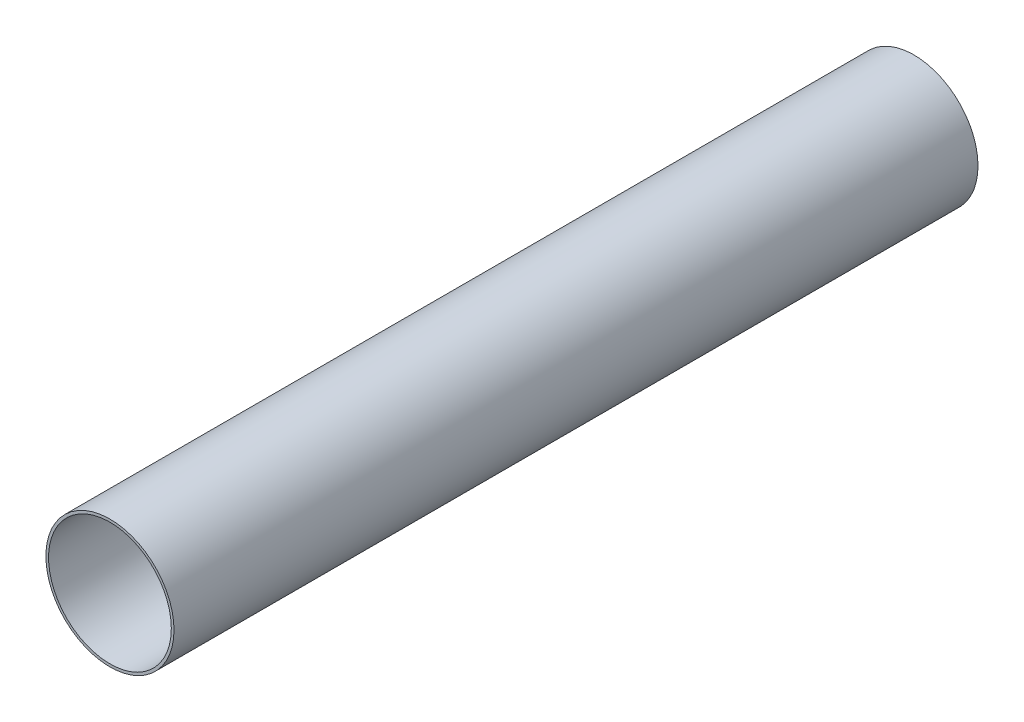
ISO-10303-21;
HEADER;
FILE_DESCRIPTION(('STEP AP214'),'2;1');
FILE_NAME('part.step','',(''),(''),'','','');
FILE_SCHEMA(('AUTOMOTIVE_DESIGN { 1 0 10303 214 1 1 1 1 }'));
ENDSEC;
DATA;
#1=APPLICATION_CONTEXT('core data for automotive mechanical design processes');
#2=APPLICATION_PROTOCOL_DEFINITION('international standard','automotive_design',2000,#1);
#3=PRODUCT_CONTEXT('',#1,'mechanical');
#4=PRODUCT('Part','Part','',(#3));
#5=PRODUCT_RELATED_PRODUCT_CATEGORY('part','',(#4));
#6=PRODUCT_DEFINITION_FORMATION('','',#4);
#7=PRODUCT_DEFINITION_CONTEXT('part definition',#1,'design');
#8=PRODUCT_DEFINITION('design','',#6,#7);
#9=PRODUCT_DEFINITION_SHAPE('','',#8);
#10=(LENGTH_UNIT() NAMED_UNIT(*) SI_UNIT(.MILLI.,.METRE.));
#11=(NAMED_UNIT(*) PLANE_ANGLE_UNIT() SI_UNIT($,.RADIAN.));
#12=(NAMED_UNIT(*) SI_UNIT($,.STERADIAN.) SOLID_ANGLE_UNIT());
#13=UNCERTAINTY_MEASURE_WITH_UNIT(LENGTH_MEASURE(1.E-05),#10,'distance_accuracy_value','');
#14=(GEOMETRIC_REPRESENTATION_CONTEXT(3) GLOBAL_UNCERTAINTY_ASSIGNED_CONTEXT((#13)) GLOBAL_UNIT_ASSIGNED_CONTEXT((#10,
#11,#12)) REPRESENTATION_CONTEXT('',''));
#15=CARTESIAN_POINT('',(0.,0.,0.));
#16=DIRECTION('',(0.,0.,1.));
#17=DIRECTION('',(1.,0.,0.));
#18=AXIS2_PLACEMENT_3D('',#15,#16,#17);
#19=CARTESIAN_POINT('',(0.140137906301864,0.,690.3));
#20=DIRECTION('',(0.,0.,-1.));
#21=DIRECTION('',(-1.,0.,0.));
#22=AXIS2_PLACEMENT_3D('',#19,#20,#21);
#23=CYLINDRICAL_SURFACE('',#22,52.7);
#24=CARTESIAN_POINT('',(0.140137906301864,0.,690.3));
#25=DIRECTION('',(0.,0.,1.));
#26=DIRECTION('',(1.,0.,0.));
#27=AXIS2_PLACEMENT_3D('',#24,#25,#26);
#28=CIRCLE('',#27,52.7);
#29=CARTESIAN_POINT('',(52.8401379063019,0.,690.3));
#30=VERTEX_POINT('',#29);
#31=EDGE_CURVE('E38',#30,#30,#28,.T.);
#32=ORIENTED_EDGE('',*,*,#31,.T.);
#33=EDGE_LOOP('',(#32));
#34=FACE_BOUND('',#33,.T.);
#35=CARTESIAN_POINT('',(0.140137906301864,0.,0.));
#36=DIRECTION('',(0.,0.,1.));
#37=DIRECTION('',(1.,0.,0.));
#38=AXIS2_PLACEMENT_3D('',#35,#36,#37);
#39=CIRCLE('',#38,52.7);
#40=CARTESIAN_POINT('',(52.8401379063019,0.,0.));
#41=VERTEX_POINT('',#40);
#42=EDGE_CURVE('E44',#41,#41,#39,.T.);
#43=ORIENTED_EDGE('',*,*,#42,.F.);
#44=EDGE_LOOP('',(#43));
#45=FACE_BOUND('',#44,.T.);
#46=ADVANCED_FACE('F31',(#34,#45),#23,.F.);
#47=CARTESIAN_POINT('',(0.140137906301864,0.,690.3));
#48=DIRECTION('',(0.,0.,-1.));
#49=DIRECTION('',(-1.,0.,0.));
#50=AXIS2_PLACEMENT_3D('',#47,#48,#49);
#51=CYLINDRICAL_SURFACE('',#50,55.);
#52=CARTESIAN_POINT('',(0.140137906301864,0.,690.3));
#53=DIRECTION('',(0.,0.,1.));
#54=DIRECTION('',(1.,0.,0.));
#55=AXIS2_PLACEMENT_3D('',#52,#53,#54);
#56=CIRCLE('',#55,55.);
#57=CARTESIAN_POINT('',(55.1401379063019,0.,690.3));
#58=VERTEX_POINT('',#57);
#59=EDGE_CURVE('E10',#58,#58,#56,.T.);
#60=ORIENTED_EDGE('',*,*,#59,.F.);
#61=EDGE_LOOP('',(#60));
#62=FACE_BOUND('',#61,.T.);
#63=CARTESIAN_POINT('',(0.140137906301864,0.,0.));
#64=DIRECTION('',(0.,0.,1.));
#65=DIRECTION('',(1.,0.,0.));
#66=AXIS2_PLACEMENT_3D('',#63,#64,#65);
#67=CIRCLE('',#66,55.);
#68=CARTESIAN_POINT('',(55.1401379063019,0.,0.));
#69=VERTEX_POINT('',#68);
#70=EDGE_CURVE('E34',#69,#69,#67,.T.);
#71=ORIENTED_EDGE('',*,*,#70,.T.);
#72=EDGE_LOOP('',(#71));
#73=FACE_BOUND('',#72,.T.);
#74=ADVANCED_FACE('F51',(#62,#73),#51,.T.);
#75=CARTESIAN_POINT('',(0.,0.,690.3));
#76=DIRECTION('',(0.,0.,1.));
#77=DIRECTION('',(1.,0.,0.));
#78=AXIS2_PLACEMENT_3D('',#75,#76,#77);
#79=PLANE('',#78);
#80=ORIENTED_EDGE('',*,*,#31,.F.);
#81=EDGE_LOOP('',(#80));
#82=FACE_BOUND('',#81,.T.);
#83=ORIENTED_EDGE('',*,*,#59,.T.);
#84=EDGE_LOOP('',(#83));
#85=FACE_BOUND('',#84,.T.);
#86=ADVANCED_FACE('F55',(#82,#85),#79,.T.);
#87=CARTESIAN_POINT('',(0.,0.,0.));
#88=DIRECTION('',(0.,0.,1.));
#89=DIRECTION('',(1.,0.,0.));
#90=AXIS2_PLACEMENT_3D('',#87,#88,#89);
#91=PLANE('',#90);
#92=ORIENTED_EDGE('',*,*,#42,.T.);
#93=EDGE_LOOP('',(#92));
#94=FACE_BOUND('',#93,.T.);
#95=ORIENTED_EDGE('',*,*,#70,.F.);
#96=EDGE_LOOP('',(#95));
#97=FACE_BOUND('',#96,.T.);
#98=ADVANCED_FACE('F53',(#94,#97),#91,.F.);
#99=CLOSED_SHELL('',(#46,#74,#86,#98));
#100=MANIFOLD_SOLID_BREP('B2',#99);
#101=ADVANCED_BREP_SHAPE_REPRESENTATION('',(#18,#100),#14);
#102=SHAPE_DEFINITION_REPRESENTATION(#9,#101);
ENDSEC;
END-ISO-10303-21;
